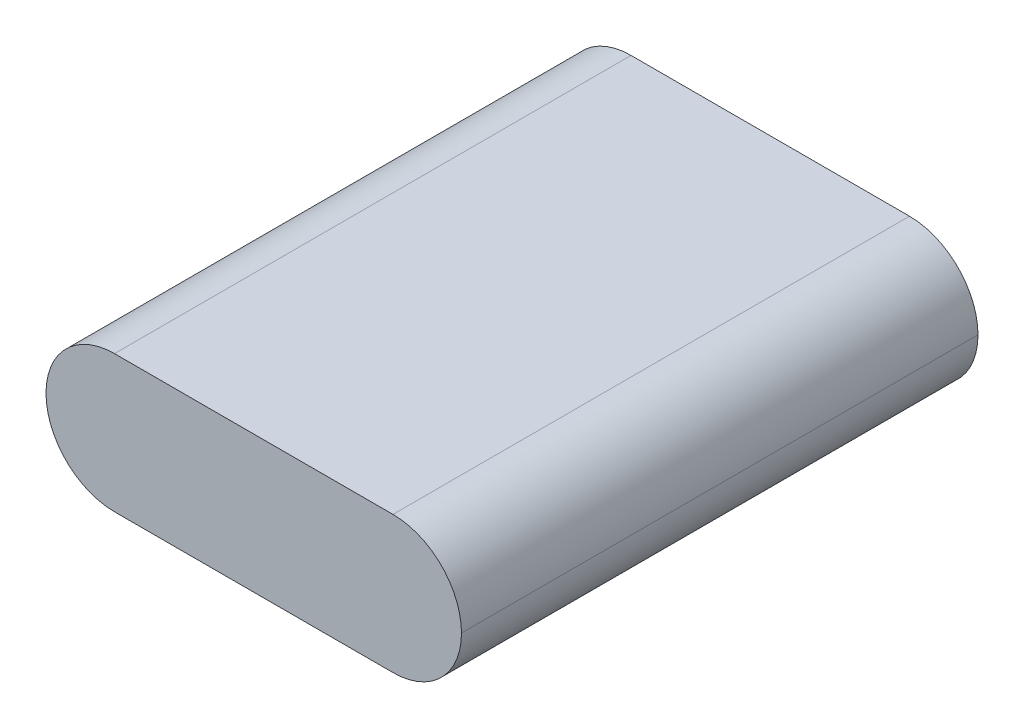
ISO-10303-21;
HEADER;
FILE_DESCRIPTION(('STEP AP214'),'2;1');
FILE_NAME('part.step','',(''),(''),'','','');
FILE_SCHEMA(('AUTOMOTIVE_DESIGN { 1 0 10303 214 1 1 1 1 }'));
ENDSEC;
DATA;
#1=APPLICATION_CONTEXT('core data for automotive mechanical design processes');
#2=APPLICATION_PROTOCOL_DEFINITION('international standard','automotive_design',2000,#1);
#3=PRODUCT_CONTEXT('',#1,'mechanical');
#4=PRODUCT('Part','Part','',(#3));
#5=PRODUCT_RELATED_PRODUCT_CATEGORY('part','',(#4));
#6=PRODUCT_DEFINITION_FORMATION('','',#4);
#7=PRODUCT_DEFINITION_CONTEXT('part definition',#1,'design');
#8=PRODUCT_DEFINITION('design','',#6,#7);
#9=PRODUCT_DEFINITION_SHAPE('','',#8);
#10=(LENGTH_UNIT() NAMED_UNIT(*) SI_UNIT(.MILLI.,.METRE.));
#11=(NAMED_UNIT(*) PLANE_ANGLE_UNIT() SI_UNIT($,.RADIAN.));
#12=(NAMED_UNIT(*) SI_UNIT($,.STERADIAN.) SOLID_ANGLE_UNIT());
#13=UNCERTAINTY_MEASURE_WITH_UNIT(LENGTH_MEASURE(1.E-05),#10,'distance_accuracy_value','');
#14=(GEOMETRIC_REPRESENTATION_CONTEXT(3) GLOBAL_UNCERTAINTY_ASSIGNED_CONTEXT((#13)) GLOBAL_UNIT_ASSIGNED_CONTEXT((#10,
#11,#12)) REPRESENTATION_CONTEXT('',''));
#15=CARTESIAN_POINT('',(0.,0.,0.));
#16=DIRECTION('',(0.,0.,1.));
#17=DIRECTION('',(1.,0.,0.));
#18=AXIS2_PLACEMENT_3D('',#15,#16,#17);
#19=CARTESIAN_POINT('',(-27.75,9.15,-34.5));
#20=DIRECTION('',(0.,0.,1.));
#21=DIRECTION('',(1.,0.,0.));
#22=AXIS2_PLACEMENT_3D('',#19,#20,#21);
#23=PLANE('',#22);
#24=CARTESIAN_POINT('',(18.6,0.,-34.5));
#25=DIRECTION('',(0.,0.,1.));
#26=DIRECTION('',(1.,0.,0.));
#27=AXIS2_PLACEMENT_3D('',#24,#25,#26);
#28=CIRCLE('',#27,9.15);
#29=CARTESIAN_POINT('',(18.6,9.15,-34.5));
#30=VERTEX_POINT('',#29);
#31=CARTESIAN_POINT('',(27.75,0.,-34.5));
#32=VERTEX_POINT('',#31);
#33=EDGE_CURVE('E93',#30,#32,#28,.F.);
#34=ORIENTED_EDGE('',*,*,#33,.T.);
#35=CARTESIAN_POINT('',(18.6,0.,-34.5));
#36=DIRECTION('',(0.,0.,1.));
#37=DIRECTION('',(1.,0.,0.));
#38=AXIS2_PLACEMENT_3D('',#35,#36,#37);
#39=CIRCLE('',#38,9.15);
#40=CARTESIAN_POINT('',(18.6,-9.15,-34.5));
#41=VERTEX_POINT('',#40);
#42=EDGE_CURVE('E88',#32,#41,#39,.F.);
#43=ORIENTED_EDGE('',*,*,#42,.T.);
#44=DIRECTION('',(-1.,0.,0.));
#45=VECTOR('',#44,1.);
#46=CARTESIAN_POINT('',(-27.75,-9.15,-34.5));
#47=LINE('',#46,#45);
#48=CARTESIAN_POINT('',(-18.6,-9.15,-34.5));
#49=VERTEX_POINT('',#48);
#50=EDGE_CURVE('E90',#41,#49,#47,.T.);
#51=ORIENTED_EDGE('',*,*,#50,.T.);
#52=CARTESIAN_POINT('',(-18.6,0.,-34.5));
#53=DIRECTION('',(0.,0.,1.));
#54=DIRECTION('',(1.,0.,0.));
#55=AXIS2_PLACEMENT_3D('',#52,#53,#54);
#56=CIRCLE('',#55,9.15);
#57=CARTESIAN_POINT('',(-27.75,0.,-34.5));
#58=VERTEX_POINT('',#57);
#59=EDGE_CURVE('E125',#49,#58,#56,.F.);
#60=ORIENTED_EDGE('',*,*,#59,.T.);
#61=CARTESIAN_POINT('',(-18.6,0.,-34.5));
#62=DIRECTION('',(0.,0.,1.));
#63=DIRECTION('',(1.,0.,0.));
#64=AXIS2_PLACEMENT_3D('',#61,#62,#63);
#65=CIRCLE('',#64,9.15);
#66=CARTESIAN_POINT('',(-18.6,9.15,-34.5));
#67=VERTEX_POINT('',#66);
#68=EDGE_CURVE('E129',#58,#67,#65,.F.);
#69=ORIENTED_EDGE('',*,*,#68,.T.);
#70=DIRECTION('',(-1.,0.,0.));
#71=VECTOR('',#70,1.);
#72=CARTESIAN_POINT('',(-27.75,9.15,-34.5));
#73=LINE('',#72,#71);
#74=EDGE_CURVE('E134',#30,#67,#73,.T.);
#75=ORIENTED_EDGE('',*,*,#74,.F.);
#76=EDGE_LOOP('',(#34,#43,#51,#60,#69,#75));
#77=FACE_BOUND('',#76,.T.);
#78=ADVANCED_FACE('F34',(#77),#23,.F.);
#79=CARTESIAN_POINT('',(-27.75,9.15,34.5));
#80=DIRECTION('',(0.,0.,-1.));
#81=DIRECTION('',(-1.,0.,0.));
#82=AXIS2_PLACEMENT_3D('',#79,#80,#81);
#83=PLANE('',#82);
#84=DIRECTION('',(1.,0.,0.));
#85=VECTOR('',#84,1.);
#86=CARTESIAN_POINT('',(-27.75,-9.15,34.5));
#87=LINE('',#86,#85);
#88=CARTESIAN_POINT('',(-18.6,-9.15,34.5));
#89=VERTEX_POINT('',#88);
#90=CARTESIAN_POINT('',(18.6,-9.15,34.5));
#91=VERTEX_POINT('',#90);
#92=EDGE_CURVE('E108',#89,#91,#87,.T.);
#93=ORIENTED_EDGE('',*,*,#92,.T.);
#94=CARTESIAN_POINT('',(18.6,0.,34.5));
#95=DIRECTION('',(0.,0.,-1.));
#96=DIRECTION('',(-1.,0.,0.));
#97=AXIS2_PLACEMENT_3D('',#94,#95,#96);
#98=CIRCLE('',#97,9.15);
#99=CARTESIAN_POINT('',(27.75,0.,34.5));
#100=VERTEX_POINT('',#99);
#101=EDGE_CURVE('E112',#91,#100,#98,.F.);
#102=ORIENTED_EDGE('',*,*,#101,.T.);
#103=CARTESIAN_POINT('',(18.6,0.,34.5));
#104=DIRECTION('',(0.,0.,-1.));
#105=DIRECTION('',(-1.,0.,0.));
#106=AXIS2_PLACEMENT_3D('',#103,#104,#105);
#107=CIRCLE('',#106,9.15);
#108=CARTESIAN_POINT('',(18.6,9.15,34.5));
#109=VERTEX_POINT('',#108);
#110=EDGE_CURVE('E57',#100,#109,#107,.F.);
#111=ORIENTED_EDGE('',*,*,#110,.T.);
#112=DIRECTION('',(1.,0.,0.));
#113=VECTOR('',#112,1.);
#114=CARTESIAN_POINT('',(-27.75,9.15,34.5));
#115=LINE('',#114,#113);
#116=CARTESIAN_POINT('',(-18.6,9.15,34.5));
#117=VERTEX_POINT('',#116);
#118=EDGE_CURVE('E131',#117,#109,#115,.T.);
#119=ORIENTED_EDGE('',*,*,#118,.F.);
#120=CARTESIAN_POINT('',(-18.6,0.,34.5));
#121=DIRECTION('',(0.,0.,-1.));
#122=DIRECTION('',(-1.,0.,0.));
#123=AXIS2_PLACEMENT_3D('',#120,#121,#122);
#124=CIRCLE('',#123,9.15);
#125=CARTESIAN_POINT('',(-27.75,0.,34.5));
#126=VERTEX_POINT('',#125);
#127=EDGE_CURVE('E51',#117,#126,#124,.F.);
#128=ORIENTED_EDGE('',*,*,#127,.T.);
#129=CARTESIAN_POINT('',(-18.6,0.,34.5));
#130=DIRECTION('',(0.,0.,-1.));
#131=DIRECTION('',(-1.,0.,0.));
#132=AXIS2_PLACEMENT_3D('',#129,#130,#131);
#133=CIRCLE('',#132,9.15);
#134=EDGE_CURVE('E114',#126,#89,#133,.F.);
#135=ORIENTED_EDGE('',*,*,#134,.T.);
#136=EDGE_LOOP('',(#93,#102,#111,#119,#128,#135));
#137=FACE_BOUND('',#136,.T.);
#138=ADVANCED_FACE('F153',(#137),#83,.F.);
#139=CARTESIAN_POINT('',(0.,9.15,0.));
#140=DIRECTION('',(0.,1.,0.));
#141=DIRECTION('',(0.,0.,1.));
#142=AXIS2_PLACEMENT_3D('',#139,#140,#141);
#143=PLANE('',#142);
#144=ORIENTED_EDGE('',*,*,#118,.T.);
#145=DIRECTION('',(0.,0.,-1.));
#146=VECTOR('',#145,1.);
#147=CARTESIAN_POINT('',(18.6,9.15,-34.5));
#148=LINE('',#147,#146);
#149=EDGE_CURVE('E11',#109,#30,#148,.T.);
#150=ORIENTED_EDGE('',*,*,#149,.T.);
#151=ORIENTED_EDGE('',*,*,#74,.T.);
#152=DIRECTION('',(0.,0.,1.));
#153=VECTOR('',#152,1.);
#154=CARTESIAN_POINT('',(-18.6,9.15,34.5));
#155=LINE('',#154,#153);
#156=EDGE_CURVE('E43',#67,#117,#155,.T.);
#157=ORIENTED_EDGE('',*,*,#156,.T.);
#158=EDGE_LOOP('',(#144,#150,#151,#157));
#159=FACE_BOUND('',#158,.T.);
#160=ADVANCED_FACE('F140',(#159),#143,.T.);
#161=CARTESIAN_POINT('',(0.,-9.15,0.));
#162=DIRECTION('',(0.,1.,0.));
#163=DIRECTION('',(0.,0.,1.));
#164=AXIS2_PLACEMENT_3D('',#161,#162,#163);
#165=PLANE('',#164);
#166=ORIENTED_EDGE('',*,*,#50,.F.);
#167=DIRECTION('',(0.,0.,-1.));
#168=VECTOR('',#167,1.);
#169=CARTESIAN_POINT('',(18.6,-9.15,0.));
#170=LINE('',#169,#168);
#171=EDGE_CURVE('E105',#41,#91,#170,.F.);
#172=ORIENTED_EDGE('',*,*,#171,.T.);
#173=ORIENTED_EDGE('',*,*,#92,.F.);
#174=DIRECTION('',(0.,0.,1.));
#175=VECTOR('',#174,1.);
#176=CARTESIAN_POINT('',(-18.6,-9.15,0.));
#177=LINE('',#176,#175);
#178=EDGE_CURVE('E98',#89,#49,#177,.F.);
#179=ORIENTED_EDGE('',*,*,#178,.T.);
#180=EDGE_LOOP('',(#166,#172,#173,#179));
#181=FACE_BOUND('',#180,.T.);
#182=ADVANCED_FACE('F103',(#181),#165,.F.);
#183=CARTESIAN_POINT('',(18.6,0.,0.));
#184=DIRECTION('',(0.,0.,1.));
#185=DIRECTION('',(1.,0.,0.));
#186=AXIS2_PLACEMENT_3D('',#183,#184,#185);
#187=CYLINDRICAL_SURFACE('',#186,9.15);
#188=ORIENTED_EDGE('',*,*,#149,.F.);
#189=ORIENTED_EDGE('',*,*,#110,.F.);
#190=DIRECTION('',(0.,0.,-1.));
#191=VECTOR('',#190,1.);
#192=CARTESIAN_POINT('',(27.75,0.,34.5));
#193=LINE('',#192,#191);
#194=EDGE_CURVE('E109',#32,#100,#193,.F.);
#195=ORIENTED_EDGE('',*,*,#194,.F.);
#196=ORIENTED_EDGE('',*,*,#33,.F.);
#197=EDGE_LOOP('',(#188,#189,#195,#196));
#198=FACE_BOUND('',#197,.T.);
#199=ADVANCED_FACE('F143',(#198),#187,.T.);
#200=CARTESIAN_POINT('',(18.6,0.,-34.5));
#201=DIRECTION('',(0.,0.,-1.));
#202=DIRECTION('',(-1.,0.,0.));
#203=AXIS2_PLACEMENT_3D('',#200,#201,#202);
#204=CYLINDRICAL_SURFACE('',#203,9.15);
#205=ORIENTED_EDGE('',*,*,#101,.F.);
#206=ORIENTED_EDGE('',*,*,#171,.F.);
#207=ORIENTED_EDGE('',*,*,#42,.F.);
#208=ORIENTED_EDGE('',*,*,#194,.T.);
#209=EDGE_LOOP('',(#205,#206,#207,#208));
#210=FACE_BOUND('',#209,.T.);
#211=ADVANCED_FACE('F111',(#210),#204,.T.);
#212=CARTESIAN_POINT('',(-18.6,0.,0.));
#213=DIRECTION('',(0.,0.,-1.));
#214=DIRECTION('',(-1.,0.,0.));
#215=AXIS2_PLACEMENT_3D('',#212,#213,#214);
#216=CYLINDRICAL_SURFACE('',#215,9.15);
#217=ORIENTED_EDGE('',*,*,#156,.F.);
#218=ORIENTED_EDGE('',*,*,#68,.F.);
#219=DIRECTION('',(0.,0.,1.));
#220=VECTOR('',#219,1.);
#221=CARTESIAN_POINT('',(-27.75,0.,-34.5));
#222=LINE('',#221,#220);
#223=EDGE_CURVE('E38',#126,#58,#222,.F.);
#224=ORIENTED_EDGE('',*,*,#223,.F.);
#225=ORIENTED_EDGE('',*,*,#127,.F.);
#226=EDGE_LOOP('',(#217,#218,#224,#225));
#227=FACE_BOUND('',#226,.T.);
#228=ADVANCED_FACE('F36',(#227),#216,.T.);
#229=CARTESIAN_POINT('',(-18.6,0.,-34.5));
#230=DIRECTION('',(0.,0.,1.));
#231=DIRECTION('',(1.,0.,0.));
#232=AXIS2_PLACEMENT_3D('',#229,#230,#231);
#233=CYLINDRICAL_SURFACE('',#232,9.15);
#234=ORIENTED_EDGE('',*,*,#59,.F.);
#235=ORIENTED_EDGE('',*,*,#178,.F.);
#236=ORIENTED_EDGE('',*,*,#134,.F.);
#237=ORIENTED_EDGE('',*,*,#223,.T.);
#238=EDGE_LOOP('',(#234,#235,#236,#237));
#239=FACE_BOUND('',#238,.T.);
#240=ADVANCED_FACE('F124',(#239),#233,.T.);
#241=CLOSED_SHELL('',(#78,#138,#160,#182,#199,#211,#228,#240));
#242=MANIFOLD_SOLID_BREP('B2',#241);
#243=ADVANCED_BREP_SHAPE_REPRESENTATION('',(#18,#242),#14);
#244=SHAPE_DEFINITION_REPRESENTATION(#9,#243);
ENDSEC;
END-ISO-10303-21;
